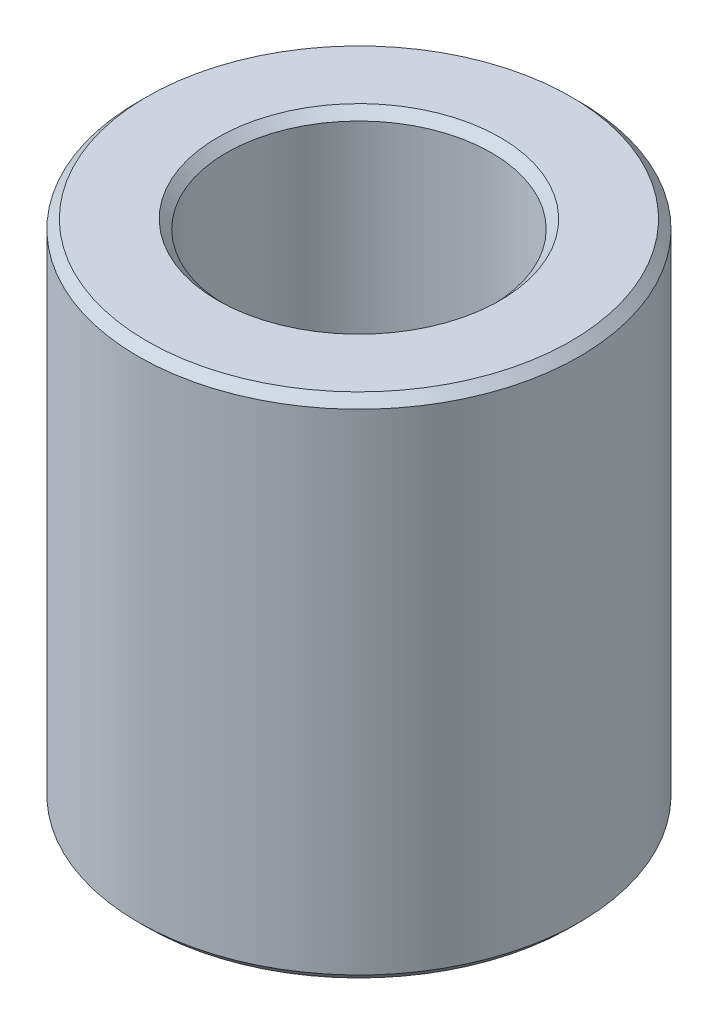
ISO-10303-21;
HEADER;
FILE_DESCRIPTION(('STEP AP214'),'2;1');
FILE_NAME('part.step','',(''),(''),'','','');
FILE_SCHEMA(('AUTOMOTIVE_DESIGN { 1 0 10303 214 1 1 1 1 }'));
ENDSEC;
DATA;
#1=APPLICATION_CONTEXT('core data for automotive mechanical design processes');
#2=APPLICATION_PROTOCOL_DEFINITION('international standard','automotive_design',2000,#1);
#3=PRODUCT_CONTEXT('',#1,'mechanical');
#4=PRODUCT('Part','Part','',(#3));
#5=PRODUCT_RELATED_PRODUCT_CATEGORY('part','',(#4));
#6=PRODUCT_DEFINITION_FORMATION('','',#4);
#7=PRODUCT_DEFINITION_CONTEXT('part definition',#1,'design');
#8=PRODUCT_DEFINITION('design','',#6,#7);
#9=PRODUCT_DEFINITION_SHAPE('','',#8);
#10=(LENGTH_UNIT() NAMED_UNIT(*) SI_UNIT(.MILLI.,.METRE.));
#11=(NAMED_UNIT(*) PLANE_ANGLE_UNIT() SI_UNIT($,.RADIAN.));
#12=(NAMED_UNIT(*) SI_UNIT($,.STERADIAN.) SOLID_ANGLE_UNIT());
#13=UNCERTAINTY_MEASURE_WITH_UNIT(LENGTH_MEASURE(1.E-05),#10,'distance_accuracy_value','');
#14=(GEOMETRIC_REPRESENTATION_CONTEXT(3) GLOBAL_UNCERTAINTY_ASSIGNED_CONTEXT((#13)) GLOBAL_UNIT_ASSIGNED_CONTEXT((#10,
#11,#12)) REPRESENTATION_CONTEXT('',''));
#15=CARTESIAN_POINT('',(0.,0.,0.));
#16=DIRECTION('',(0.,0.,1.));
#17=DIRECTION('',(1.,0.,0.));
#18=AXIS2_PLACEMENT_3D('',#15,#16,#17);
#19=CARTESIAN_POINT('',(0.,11.5,0.));
#20=DIRECTION('',(0.,1.,0.));
#21=DIRECTION('',(0.,0.,1.));
#22=AXIS2_PLACEMENT_3D('',#19,#20,#21);
#23=PLANE('',#22);
#24=CARTESIAN_POINT('',(0.,11.5,0.));
#25=DIRECTION('',(0.,1.,0.));
#26=DIRECTION('',(0.,0.,1.));
#27=AXIS2_PLACEMENT_3D('',#24,#25,#26);
#28=CIRCLE('',#27,3.2);
#29=CARTESIAN_POINT('',(0.,11.5,3.2));
#30=VERTEX_POINT('',#29);
#31=EDGE_CURVE('E50',#30,#30,#28,.F.);
#32=ORIENTED_EDGE('',*,*,#31,.T.);
#33=EDGE_LOOP('',(#32));
#34=FACE_BOUND('',#33,.T.);
#35=CARTESIAN_POINT('',(0.,11.5,0.));
#36=DIRECTION('',(0.,1.,0.));
#37=DIRECTION('',(0.,0.,1.));
#38=AXIS2_PLACEMENT_3D('',#35,#36,#37);
#39=CIRCLE('',#38,4.8);
#40=CARTESIAN_POINT('',(0.,11.5,4.8));
#41=VERTEX_POINT('',#40);
#42=EDGE_CURVE('E53',#41,#41,#39,.T.);
#43=ORIENTED_EDGE('',*,*,#42,.T.);
#44=EDGE_LOOP('',(#43));
#45=FACE_BOUND('',#44,.T.);
#46=ADVANCED_FACE('F30',(#34,#45),#23,.T.);
#47=CARTESIAN_POINT('',(0.,0.,0.));
#48=DIRECTION('',(0.,1.,0.));
#49=DIRECTION('',(0.,0.,1.));
#50=AXIS2_PLACEMENT_3D('',#47,#48,#49);
#51=PLANE('',#50);
#52=CARTESIAN_POINT('',(0.,0.,0.));
#53=DIRECTION('',(0.,1.,0.));
#54=DIRECTION('',(0.,0.,1.));
#55=AXIS2_PLACEMENT_3D('',#52,#53,#54);
#56=CIRCLE('',#55,3.2);
#57=CARTESIAN_POINT('',(0.,0.,3.2));
#58=VERTEX_POINT('',#57);
#59=EDGE_CURVE('E10',#58,#58,#56,.T.);
#60=ORIENTED_EDGE('',*,*,#59,.T.);
#61=EDGE_LOOP('',(#60));
#62=FACE_BOUND('',#61,.T.);
#63=CARTESIAN_POINT('',(0.,0.,0.));
#64=DIRECTION('',(0.,1.,0.));
#65=DIRECTION('',(0.,0.,1.));
#66=AXIS2_PLACEMENT_3D('',#63,#64,#65);
#67=CIRCLE('',#66,4.8);
#68=CARTESIAN_POINT('',(0.,0.,4.8));
#69=VERTEX_POINT('',#68);
#70=EDGE_CURVE('E37',#69,#69,#67,.F.);
#71=ORIENTED_EDGE('',*,*,#70,.T.);
#72=EDGE_LOOP('',(#71));
#73=FACE_BOUND('',#72,.T.);
#74=ADVANCED_FACE('F78',(#62,#73),#51,.F.);
#75=CARTESIAN_POINT('',(0.,11.5,0.));
#76=DIRECTION('',(0.,-1.,0.));
#77=DIRECTION('',(0.,0.,-1.));
#78=AXIS2_PLACEMENT_3D('',#75,#76,#77);
#79=CYLINDRICAL_SURFACE('',#78,5.);
#80=CARTESIAN_POINT('',(0.,11.3,0.));
#81=DIRECTION('',(0.,1.,0.));
#82=DIRECTION('',(0.,0.,1.));
#83=AXIS2_PLACEMENT_3D('',#80,#81,#82);
#84=CIRCLE('',#83,5.);
#85=CARTESIAN_POINT('',(0.,11.3,5.));
#86=VERTEX_POINT('',#85);
#87=EDGE_CURVE('E41',#86,#86,#84,.F.);
#88=ORIENTED_EDGE('',*,*,#87,.T.);
#89=EDGE_LOOP('',(#88));
#90=FACE_BOUND('',#89,.T.);
#91=CARTESIAN_POINT('',(0.,0.199999999999997,0.));
#92=DIRECTION('',(0.,1.,0.));
#93=DIRECTION('',(0.,0.,1.));
#94=AXIS2_PLACEMENT_3D('',#91,#92,#93);
#95=CIRCLE('',#94,5.);
#96=CARTESIAN_POINT('',(0.,0.199999999999997,5.));
#97=VERTEX_POINT('',#96);
#98=EDGE_CURVE('E45',#97,#97,#95,.T.);
#99=ORIENTED_EDGE('',*,*,#98,.T.);
#100=EDGE_LOOP('',(#99));
#101=FACE_BOUND('',#100,.T.);
#102=ADVANCED_FACE('F84',(#90,#101),#79,.T.);
#103=CARTESIAN_POINT('',(0.,11.5,0.));
#104=DIRECTION('',(0.,-1.,0.));
#105=DIRECTION('',(0.,0.,-1.));
#106=AXIS2_PLACEMENT_3D('',#103,#104,#105);
#107=CYLINDRICAL_SURFACE('',#106,3.);
#108=CARTESIAN_POINT('',(0.,11.3,0.));
#109=DIRECTION('',(0.,1.,0.));
#110=DIRECTION('',(0.,0.,1.));
#111=AXIS2_PLACEMENT_3D('',#108,#109,#110);
#112=CIRCLE('',#111,3.);
#113=CARTESIAN_POINT('',(0.,11.3,3.));
#114=VERTEX_POINT('',#113);
#115=EDGE_CURVE('E56',#114,#114,#112,.T.);
#116=ORIENTED_EDGE('',*,*,#115,.T.);
#117=EDGE_LOOP('',(#116));
#118=FACE_BOUND('',#117,.T.);
#119=CARTESIAN_POINT('',(0.,0.200000000000002,0.));
#120=DIRECTION('',(0.,1.,0.));
#121=DIRECTION('',(0.,0.,1.));
#122=AXIS2_PLACEMENT_3D('',#119,#120,#121);
#123=CIRCLE('',#122,3.);
#124=CARTESIAN_POINT('',(0.,0.200000000000002,3.));
#125=VERTEX_POINT('',#124);
#126=EDGE_CURVE('E59',#125,#125,#123,.F.);
#127=ORIENTED_EDGE('',*,*,#126,.T.);
#128=EDGE_LOOP('',(#127));
#129=FACE_BOUND('',#128,.T.);
#130=ADVANCED_FACE('F63',(#118,#129),#107,.F.);
#131=CARTESIAN_POINT('',(0.,11.3,0.));
#132=DIRECTION('',(0.,1.,0.));
#133=DIRECTION('',(0.,0.,1.));
#134=AXIS2_PLACEMENT_3D('',#131,#132,#133);
#135=CONICAL_SURFACE('',#134,3.,0.785398163397447);
#136=ORIENTED_EDGE('',*,*,#31,.F.);
#137=EDGE_LOOP('',(#136));
#138=FACE_BOUND('',#137,.T.);
#139=ORIENTED_EDGE('',*,*,#115,.F.);
#140=EDGE_LOOP('',(#139));
#141=FACE_BOUND('',#140,.T.);
#142=ADVANCED_FACE('F74',(#138,#141),#135,.F.);
#143=CARTESIAN_POINT('',(0.,11.5,0.));
#144=DIRECTION('',(0.,-1.,0.));
#145=DIRECTION('',(0.,0.,-1.));
#146=AXIS2_PLACEMENT_3D('',#143,#144,#145);
#147=CONICAL_SURFACE('',#146,4.8,0.785398163397453);
#148=ORIENTED_EDGE('',*,*,#87,.F.);
#149=EDGE_LOOP('',(#148));
#150=FACE_BOUND('',#149,.T.);
#151=ORIENTED_EDGE('',*,*,#42,.F.);
#152=EDGE_LOOP('',(#151));
#153=FACE_BOUND('',#152,.T.);
#154=ADVANCED_FACE('F68',(#150,#153),#147,.T.);
#155=CARTESIAN_POINT('',(0.,0.,0.));
#156=DIRECTION('',(0.,-1.,0.));
#157=DIRECTION('',(0.,0.,-1.));
#158=AXIS2_PLACEMENT_3D('',#155,#156,#157);
#159=CONICAL_SURFACE('',#158,3.2,0.785398163397444);
#160=ORIENTED_EDGE('',*,*,#126,.F.);
#161=EDGE_LOOP('',(#160));
#162=FACE_BOUND('',#161,.T.);
#163=ORIENTED_EDGE('',*,*,#59,.F.);
#164=EDGE_LOOP('',(#163));
#165=FACE_BOUND('',#164,.T.);
#166=ADVANCED_FACE('F65',(#162,#165),#159,.F.);
#167=CARTESIAN_POINT('',(0.,0.199999999999997,0.));
#168=DIRECTION('',(0.,1.,0.));
#169=DIRECTION('',(0.,0.,1.));
#170=AXIS2_PLACEMENT_3D('',#167,#168,#169);
#171=CONICAL_SURFACE('',#170,5.,0.785398163397453);
#172=ORIENTED_EDGE('',*,*,#70,.F.);
#173=EDGE_LOOP('',(#172));
#174=FACE_BOUND('',#173,.T.);
#175=ORIENTED_EDGE('',*,*,#98,.F.);
#176=EDGE_LOOP('',(#175));
#177=FACE_BOUND('',#176,.T.);
#178=ADVANCED_FACE('F32',(#174,#177),#171,.T.);
#179=CLOSED_SHELL('',(#46,#74,#102,#130,#142,#154,#166,#178));
#180=MANIFOLD_SOLID_BREP('B2',#179);
#181=ADVANCED_BREP_SHAPE_REPRESENTATION('',(#18,#180),#14);
#182=SHAPE_DEFINITION_REPRESENTATION(#9,#181);
ENDSEC;
END-ISO-10303-21;
